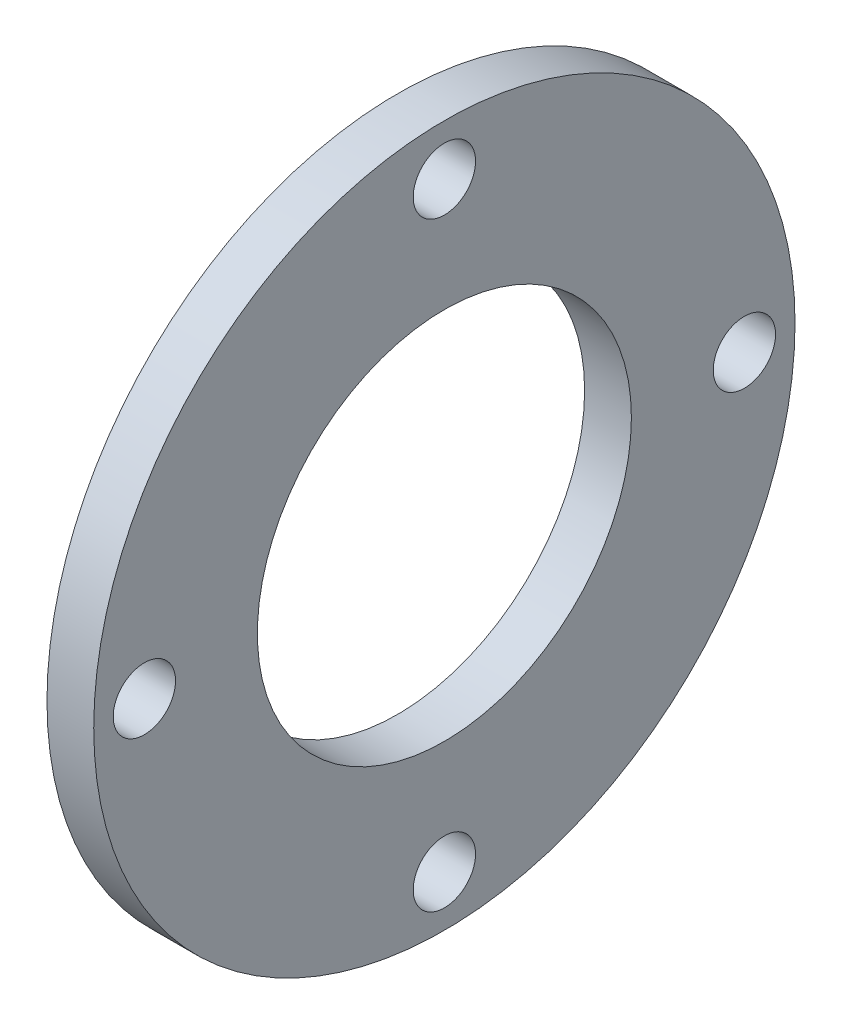
ISO-10303-21;
HEADER;
FILE_DESCRIPTION(('STEP AP214'),'2;1');
FILE_NAME('part.step','',(''),(''),'','','');
FILE_SCHEMA(('AUTOMOTIVE_DESIGN { 1 0 10303 214 1 1 1 1 }'));
ENDSEC;
DATA;
#1=APPLICATION_CONTEXT('core data for automotive mechanical design processes');
#2=APPLICATION_PROTOCOL_DEFINITION('international standard','automotive_design',2000,#1);
#3=PRODUCT_CONTEXT('',#1,'mechanical');
#4=PRODUCT('Part','Part','',(#3));
#5=PRODUCT_RELATED_PRODUCT_CATEGORY('part','',(#4));
#6=PRODUCT_DEFINITION_FORMATION('','',#4);
#7=PRODUCT_DEFINITION_CONTEXT('part definition',#1,'design');
#8=PRODUCT_DEFINITION('design','',#6,#7);
#9=PRODUCT_DEFINITION_SHAPE('','',#8);
#10=(LENGTH_UNIT() NAMED_UNIT(*) SI_UNIT(.MILLI.,.METRE.));
#11=(NAMED_UNIT(*) PLANE_ANGLE_UNIT() SI_UNIT($,.RADIAN.));
#12=(NAMED_UNIT(*) SI_UNIT($,.STERADIAN.) SOLID_ANGLE_UNIT());
#13=UNCERTAINTY_MEASURE_WITH_UNIT(LENGTH_MEASURE(1.E-05),#10,'distance_accuracy_value','');
#14=(GEOMETRIC_REPRESENTATION_CONTEXT(3) GLOBAL_UNCERTAINTY_ASSIGNED_CONTEXT((#13)) GLOBAL_UNIT_ASSIGNED_CONTEXT((#10,
#11,#12)) REPRESENTATION_CONTEXT('',''));
#15=CARTESIAN_POINT('',(0.,0.,0.));
#16=DIRECTION('',(0.,0.,1.));
#17=DIRECTION('',(1.,0.,0.));
#18=AXIS2_PLACEMENT_3D('',#15,#16,#17);
#19=CARTESIAN_POINT('',(3.,0.,0.));
#20=DIRECTION('',(1.,0.,0.));
#21=DIRECTION('',(0.,0.,-1.));
#22=AXIS2_PLACEMENT_3D('',#19,#20,#21);
#23=PLANE('',#22);
#24=CARTESIAN_POINT('',(3.,-19.25,1.34422031545461E-13));
#25=DIRECTION('',(1.,0.,0.));
#26=DIRECTION('',(0.,0.,-1.));
#27=AXIS2_PLACEMENT_3D('',#24,#25,#26);
#28=CIRCLE('',#27,2.);
#29=CARTESIAN_POINT('',(3.,-19.25,-1.99999999999987));
#30=VERTEX_POINT('',#29);
#31=EDGE_CURVE('E65',#30,#30,#28,.T.);
#32=ORIENTED_EDGE('',*,*,#31,.F.);
#33=EDGE_LOOP('',(#32));
#34=FACE_BOUND('',#33,.T.);
#35=CARTESIAN_POINT('',(3.,19.25,0.));
#36=DIRECTION('',(1.,0.,0.));
#37=DIRECTION('',(0.,0.,-1.));
#38=AXIS2_PLACEMENT_3D('',#35,#36,#37);
#39=CIRCLE('',#38,2.);
#40=CARTESIAN_POINT('',(3.,19.25,-2.));
#41=VERTEX_POINT('',#40);
#42=EDGE_CURVE('E53',#41,#41,#39,.T.);
#43=ORIENTED_EDGE('',*,*,#42,.F.);
#44=EDGE_LOOP('',(#43));
#45=FACE_BOUND('',#44,.T.);
#46=CARTESIAN_POINT('',(3.,0.,0.));
#47=DIRECTION('',(1.,0.,0.));
#48=DIRECTION('',(0.,0.,-1.));
#49=AXIS2_PLACEMENT_3D('',#46,#47,#48);
#50=CIRCLE('',#49,22.5);
#51=CARTESIAN_POINT('',(3.,0.,-22.5));
#52=VERTEX_POINT('',#51);
#53=EDGE_CURVE('E10',#52,#52,#50,.T.);
#54=ORIENTED_EDGE('',*,*,#53,.T.);
#55=EDGE_LOOP('',(#54));
#56=FACE_BOUND('',#55,.T.);
#57=CARTESIAN_POINT('',(3.,0.,0.));
#58=DIRECTION('',(1.,0.,0.));
#59=DIRECTION('',(0.,0.,-1.));
#60=AXIS2_PLACEMENT_3D('',#57,#58,#59);
#61=CIRCLE('',#60,12.);
#62=CARTESIAN_POINT('',(3.,0.,-12.));
#63=VERTEX_POINT('',#62);
#64=EDGE_CURVE('E48',#63,#63,#61,.T.);
#65=ORIENTED_EDGE('',*,*,#64,.F.);
#66=EDGE_LOOP('',(#65));
#67=FACE_BOUND('',#66,.T.);
#68=CARTESIAN_POINT('',(3.,0.,-19.25));
#69=DIRECTION('',(1.,0.,0.));
#70=DIRECTION('',(0.,0.,-1.));
#71=AXIS2_PLACEMENT_3D('',#68,#69,#70);
#72=CIRCLE('',#71,2.);
#73=CARTESIAN_POINT('',(3.,0.,-21.25));
#74=VERTEX_POINT('',#73);
#75=EDGE_CURVE('E59',#74,#74,#72,.T.);
#76=ORIENTED_EDGE('',*,*,#75,.F.);
#77=EDGE_LOOP('',(#76));
#78=FACE_BOUND('',#77,.T.);
#79=CARTESIAN_POINT('',(3.,2.01633047318191E-13,19.25));
#80=DIRECTION('',(1.,0.,0.));
#81=DIRECTION('',(0.,0.,-1.));
#82=AXIS2_PLACEMENT_3D('',#79,#80,#81);
#83=CIRCLE('',#82,2.);
#84=CARTESIAN_POINT('',(3.,2.01633047318191E-13,17.25));
#85=VERTEX_POINT('',#84);
#86=EDGE_CURVE('E71',#85,#85,#83,.T.);
#87=ORIENTED_EDGE('',*,*,#86,.F.);
#88=EDGE_LOOP('',(#87));
#89=FACE_BOUND('',#88,.T.);
#90=ADVANCED_FACE('F37',(#34,#45,#56,#67,#78,#89),#23,.T.);
#91=CARTESIAN_POINT('',(0.,0.,0.));
#92=DIRECTION('',(1.,0.,0.));
#93=DIRECTION('',(0.,0.,-1.));
#94=AXIS2_PLACEMENT_3D('',#91,#92,#93);
#95=PLANE('',#94);
#96=CARTESIAN_POINT('',(0.,0.,0.));
#97=DIRECTION('',(1.,0.,0.));
#98=DIRECTION('',(0.,0.,-1.));
#99=AXIS2_PLACEMENT_3D('',#96,#97,#98);
#100=CIRCLE('',#99,22.5);
#101=CARTESIAN_POINT('',(0.,0.,-22.5));
#102=VERTEX_POINT('',#101);
#103=EDGE_CURVE('E41',#102,#102,#100,.T.);
#104=ORIENTED_EDGE('',*,*,#103,.F.);
#105=EDGE_LOOP('',(#104));
#106=FACE_BOUND('',#105,.T.);
#107=CARTESIAN_POINT('',(0.,0.,0.));
#108=DIRECTION('',(1.,0.,0.));
#109=DIRECTION('',(0.,0.,-1.));
#110=AXIS2_PLACEMENT_3D('',#107,#108,#109);
#111=CIRCLE('',#110,12.);
#112=CARTESIAN_POINT('',(0.,0.,-12.));
#113=VERTEX_POINT('',#112);
#114=EDGE_CURVE('E50',#113,#113,#111,.T.);
#115=ORIENTED_EDGE('',*,*,#114,.T.);
#116=EDGE_LOOP('',(#115));
#117=FACE_BOUND('',#116,.T.);
#118=CARTESIAN_POINT('',(0.,19.25,0.));
#119=DIRECTION('',(1.,0.,0.));
#120=DIRECTION('',(0.,0.,-1.));
#121=AXIS2_PLACEMENT_3D('',#118,#119,#120);
#122=CIRCLE('',#121,2.);
#123=CARTESIAN_POINT('',(0.,19.25,-2.));
#124=VERTEX_POINT('',#123);
#125=EDGE_CURVE('E56',#124,#124,#122,.T.);
#126=ORIENTED_EDGE('',*,*,#125,.T.);
#127=EDGE_LOOP('',(#126));
#128=FACE_BOUND('',#127,.T.);
#129=CARTESIAN_POINT('',(0.,0.,-19.25));
#130=DIRECTION('',(1.,0.,0.));
#131=DIRECTION('',(0.,0.,-1.));
#132=AXIS2_PLACEMENT_3D('',#129,#130,#131);
#133=CIRCLE('',#132,2.);
#134=CARTESIAN_POINT('',(0.,0.,-21.25));
#135=VERTEX_POINT('',#134);
#136=EDGE_CURVE('E62',#135,#135,#133,.T.);
#137=ORIENTED_EDGE('',*,*,#136,.T.);
#138=EDGE_LOOP('',(#137));
#139=FACE_BOUND('',#138,.T.);
#140=CARTESIAN_POINT('',(0.,-19.25,1.34422031545461E-13));
#141=DIRECTION('',(1.,0.,0.));
#142=DIRECTION('',(0.,0.,-1.));
#143=AXIS2_PLACEMENT_3D('',#140,#141,#142);
#144=CIRCLE('',#143,2.);
#145=CARTESIAN_POINT('',(0.,-19.25,-1.99999999999987));
#146=VERTEX_POINT('',#145);
#147=EDGE_CURVE('E68',#146,#146,#144,.T.);
#148=ORIENTED_EDGE('',*,*,#147,.T.);
#149=EDGE_LOOP('',(#148));
#150=FACE_BOUND('',#149,.T.);
#151=CARTESIAN_POINT('',(0.,2.01633047318191E-13,19.25));
#152=DIRECTION('',(1.,0.,0.));
#153=DIRECTION('',(0.,0.,-1.));
#154=AXIS2_PLACEMENT_3D('',#151,#152,#153);
#155=CIRCLE('',#154,2.);
#156=CARTESIAN_POINT('',(0.,2.01633047318191E-13,17.25));
#157=VERTEX_POINT('',#156);
#158=EDGE_CURVE('E74',#157,#157,#155,.T.);
#159=ORIENTED_EDGE('',*,*,#158,.T.);
#160=EDGE_LOOP('',(#159));
#161=FACE_BOUND('',#160,.T.);
#162=ADVANCED_FACE('F84',(#106,#117,#128,#139,#150,#161),#95,.F.);
#163=CARTESIAN_POINT('',(3.,0.,0.));
#164=DIRECTION('',(-1.,0.,0.));
#165=DIRECTION('',(0.,0.,1.));
#166=AXIS2_PLACEMENT_3D('',#163,#164,#165);
#167=CYLINDRICAL_SURFACE('',#166,22.5);
#168=ORIENTED_EDGE('',*,*,#53,.F.);
#169=EDGE_LOOP('',(#168));
#170=FACE_BOUND('',#169,.T.);
#171=ORIENTED_EDGE('',*,*,#103,.T.);
#172=EDGE_LOOP('',(#171));
#173=FACE_BOUND('',#172,.T.);
#174=ADVANCED_FACE('F39',(#170,#173),#167,.T.);
#175=CARTESIAN_POINT('',(3.,0.,0.));
#176=DIRECTION('',(-1.,0.,0.));
#177=DIRECTION('',(0.,0.,1.));
#178=AXIS2_PLACEMENT_3D('',#175,#176,#177);
#179=CYLINDRICAL_SURFACE('',#178,12.);
#180=ORIENTED_EDGE('',*,*,#64,.T.);
#181=EDGE_LOOP('',(#180));
#182=FACE_BOUND('',#181,.T.);
#183=ORIENTED_EDGE('',*,*,#114,.F.);
#184=EDGE_LOOP('',(#183));
#185=FACE_BOUND('',#184,.T.);
#186=ADVANCED_FACE('F94',(#182,#185),#179,.F.);
#187=CARTESIAN_POINT('',(3.,19.25,0.));
#188=DIRECTION('',(-1.,0.,0.));
#189=DIRECTION('',(0.,0.,1.));
#190=AXIS2_PLACEMENT_3D('',#187,#188,#189);
#191=CYLINDRICAL_SURFACE('',#190,2.);
#192=ORIENTED_EDGE('',*,*,#42,.T.);
#193=EDGE_LOOP('',(#192));
#194=FACE_BOUND('',#193,.T.);
#195=ORIENTED_EDGE('',*,*,#125,.F.);
#196=EDGE_LOOP('',(#195));
#197=FACE_BOUND('',#196,.T.);
#198=ADVANCED_FACE('F97',(#194,#197),#191,.F.);
#199=CARTESIAN_POINT('',(3.,0.,-19.25));
#200=DIRECTION('',(-1.,0.,0.));
#201=DIRECTION('',(0.,0.,1.));
#202=AXIS2_PLACEMENT_3D('',#199,#200,#201);
#203=CYLINDRICAL_SURFACE('',#202,2.);
#204=ORIENTED_EDGE('',*,*,#75,.T.);
#205=EDGE_LOOP('',(#204));
#206=FACE_BOUND('',#205,.T.);
#207=ORIENTED_EDGE('',*,*,#136,.F.);
#208=EDGE_LOOP('',(#207));
#209=FACE_BOUND('',#208,.T.);
#210=ADVANCED_FACE('F101',(#206,#209),#203,.F.);
#211=CARTESIAN_POINT('',(3.,-19.25,1.34422031545461E-13));
#212=DIRECTION('',(-1.,0.,0.));
#213=DIRECTION('',(0.,0.,1.));
#214=AXIS2_PLACEMENT_3D('',#211,#212,#213);
#215=CYLINDRICAL_SURFACE('',#214,2.);
#216=ORIENTED_EDGE('',*,*,#31,.T.);
#217=EDGE_LOOP('',(#216));
#218=FACE_BOUND('',#217,.T.);
#219=ORIENTED_EDGE('',*,*,#147,.F.);
#220=EDGE_LOOP('',(#219));
#221=FACE_BOUND('',#220,.T.);
#222=ADVANCED_FACE('F105',(#218,#221),#215,.F.);
#223=CARTESIAN_POINT('',(3.,2.01633047318191E-13,19.25));
#224=DIRECTION('',(-1.,0.,0.));
#225=DIRECTION('',(0.,0.,1.));
#226=AXIS2_PLACEMENT_3D('',#223,#224,#225);
#227=CYLINDRICAL_SURFACE('',#226,2.);
#228=ORIENTED_EDGE('',*,*,#86,.T.);
#229=EDGE_LOOP('',(#228));
#230=FACE_BOUND('',#229,.T.);
#231=ORIENTED_EDGE('',*,*,#158,.F.);
#232=EDGE_LOOP('',(#231));
#233=FACE_BOUND('',#232,.T.);
#234=ADVANCED_FACE('F80',(#230,#233),#227,.F.);
#235=CLOSED_SHELL('',(#90,#162,#174,#186,#198,#210,#222,#234));
#236=MANIFOLD_SOLID_BREP('B2',#235);
#237=ADVANCED_BREP_SHAPE_REPRESENTATION('',(#18,#236),#14);
#238=SHAPE_DEFINITION_REPRESENTATION(#9,#237);
ENDSEC;
END-ISO-10303-21;
